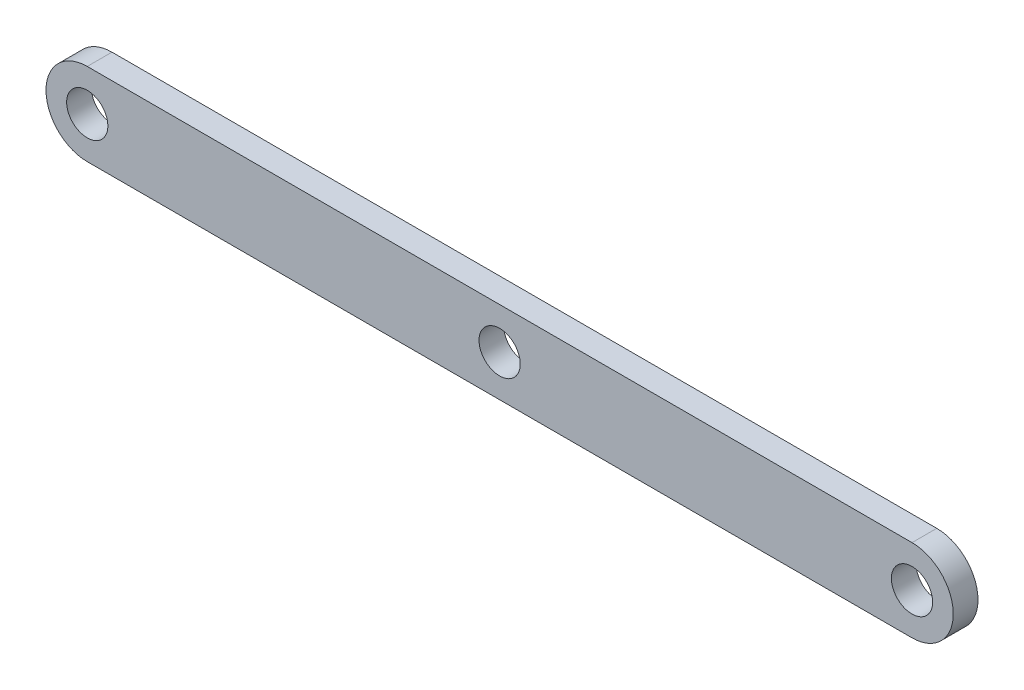
ISO-10303-21;
HEADER;
FILE_DESCRIPTION(('STEP AP214'),'2;1');
FILE_NAME('part.step','',(''),(''),'','','');
FILE_SCHEMA(('AUTOMOTIVE_DESIGN { 1 0 10303 214 1 1 1 1 }'));
ENDSEC;
DATA;
#1=APPLICATION_CONTEXT('core data for automotive mechanical design processes');
#2=APPLICATION_PROTOCOL_DEFINITION('international standard','automotive_design',2000,#1);
#3=PRODUCT_CONTEXT('',#1,'mechanical');
#4=PRODUCT('Part','Part','',(#3));
#5=PRODUCT_RELATED_PRODUCT_CATEGORY('part','',(#4));
#6=PRODUCT_DEFINITION_FORMATION('','',#4);
#7=PRODUCT_DEFINITION_CONTEXT('part definition',#1,'design');
#8=PRODUCT_DEFINITION('design','',#6,#7);
#9=PRODUCT_DEFINITION_SHAPE('','',#8);
#10=(LENGTH_UNIT() NAMED_UNIT(*) SI_UNIT(.MILLI.,.METRE.));
#11=(NAMED_UNIT(*) PLANE_ANGLE_UNIT() SI_UNIT($,.RADIAN.));
#12=(NAMED_UNIT(*) SI_UNIT($,.STERADIAN.) SOLID_ANGLE_UNIT());
#13=UNCERTAINTY_MEASURE_WITH_UNIT(LENGTH_MEASURE(1.E-05),#10,'distance_accuracy_value','');
#14=(GEOMETRIC_REPRESENTATION_CONTEXT(3) GLOBAL_UNCERTAINTY_ASSIGNED_CONTEXT((#13)) GLOBAL_UNIT_ASSIGNED_CONTEXT((#10,
#11,#12)) REPRESENTATION_CONTEXT('',''));
#15=CARTESIAN_POINT('',(0.,0.,0.));
#16=DIRECTION('',(0.,0.,1.));
#17=DIRECTION('',(1.,0.,0.));
#18=AXIS2_PLACEMENT_3D('',#15,#16,#17);
#19=CARTESIAN_POINT('',(0.,5.,3.));
#20=DIRECTION('',(0.,0.,-1.));
#21=DIRECTION('',(-1.,0.,0.));
#22=AXIS2_PLACEMENT_3D('',#19,#20,#21);
#23=CYLINDRICAL_SURFACE('',#22,5.);
#24=CARTESIAN_POINT('',(0.,5.,0.));
#25=DIRECTION('',(0.,0.,1.));
#26=DIRECTION('',(1.,0.,0.));
#27=AXIS2_PLACEMENT_3D('',#24,#25,#26);
#28=CIRCLE('',#27,5.);
#29=CARTESIAN_POINT('',(0.,10.,0.));
#30=VERTEX_POINT('',#29);
#31=CARTESIAN_POINT('',(0.,0.,0.));
#32=VERTEX_POINT('',#31);
#33=EDGE_CURVE('E97',#30,#32,#28,.T.);
#34=ORIENTED_EDGE('',*,*,#33,.T.);
#35=DIRECTION('',(0.,0.,-1.));
#36=VECTOR('',#35,1.);
#37=CARTESIAN_POINT('',(0.,0.,3.));
#38=LINE('',#37,#36);
#39=CARTESIAN_POINT('',(0.,0.,3.));
#40=VERTEX_POINT('',#39);
#41=EDGE_CURVE('E11',#40,#32,#38,.T.);
#42=ORIENTED_EDGE('',*,*,#41,.F.);
#43=CARTESIAN_POINT('',(0.,5.,3.));
#44=DIRECTION('',(0.,0.,1.));
#45=DIRECTION('',(1.,0.,0.));
#46=AXIS2_PLACEMENT_3D('',#43,#44,#45);
#47=CIRCLE('',#46,5.);
#48=CARTESIAN_POINT('',(0.,10.,3.));
#49=VERTEX_POINT('',#48);
#50=EDGE_CURVE('E85',#49,#40,#47,.T.);
#51=ORIENTED_EDGE('',*,*,#50,.F.);
#52=DIRECTION('',(0.,0.,-1.));
#53=VECTOR('',#52,1.);
#54=CARTESIAN_POINT('',(0.,10.,3.));
#55=LINE('',#54,#53);
#56=EDGE_CURVE('E93',#49,#30,#55,.T.);
#57=ORIENTED_EDGE('',*,*,#56,.T.);
#58=EDGE_LOOP('',(#34,#42,#51,#57));
#59=FACE_BOUND('',#58,.T.);
#60=ADVANCED_FACE('F34',(#59),#23,.T.);
#61=CARTESIAN_POINT('',(0.,0.,3.));
#62=DIRECTION('',(0.,1.,0.));
#63=DIRECTION('',(0.,0.,1.));
#64=AXIS2_PLACEMENT_3D('',#61,#62,#63);
#65=PLANE('',#64);
#66=DIRECTION('',(1.,0.,0.));
#67=VECTOR('',#66,1.);
#68=CARTESIAN_POINT('',(0.,0.,0.));
#69=LINE('',#68,#67);
#70=CARTESIAN_POINT('',(100.,0.,0.));
#71=VERTEX_POINT('',#70);
#72=EDGE_CURVE('E89',#32,#71,#69,.T.);
#73=ORIENTED_EDGE('',*,*,#72,.T.);
#74=DIRECTION('',(0.,0.,-1.));
#75=VECTOR('',#74,1.);
#76=CARTESIAN_POINT('',(100.,0.,3.));
#77=LINE('',#76,#75);
#78=CARTESIAN_POINT('',(100.,0.,3.));
#79=VERTEX_POINT('',#78);
#80=EDGE_CURVE('E42',#79,#71,#77,.T.);
#81=ORIENTED_EDGE('',*,*,#80,.F.);
#82=DIRECTION('',(1.,0.,0.));
#83=VECTOR('',#82,1.);
#84=CARTESIAN_POINT('',(0.,0.,3.));
#85=LINE('',#84,#83);
#86=EDGE_CURVE('E80',#40,#79,#85,.T.);
#87=ORIENTED_EDGE('',*,*,#86,.F.);
#88=ORIENTED_EDGE('',*,*,#41,.T.);
#89=EDGE_LOOP('',(#73,#81,#87,#88));
#90=FACE_BOUND('',#89,.T.);
#91=ADVANCED_FACE('F88',(#90),#65,.F.);
#92=CARTESIAN_POINT('',(100.,5.,3.));
#93=DIRECTION('',(0.,0.,-1.));
#94=DIRECTION('',(-1.,0.,0.));
#95=AXIS2_PLACEMENT_3D('',#92,#93,#94);
#96=CYLINDRICAL_SURFACE('',#95,5.);
#97=CARTESIAN_POINT('',(100.,5.,0.));
#98=DIRECTION('',(0.,0.,1.));
#99=DIRECTION('',(-1.,0.,0.));
#100=AXIS2_PLACEMENT_3D('',#97,#98,#99);
#101=CIRCLE('',#100,5.);
#102=CARTESIAN_POINT('',(100.,10.,0.));
#103=VERTEX_POINT('',#102);
#104=EDGE_CURVE('E67',#71,#103,#101,.T.);
#105=ORIENTED_EDGE('',*,*,#104,.T.);
#106=DIRECTION('',(0.,0.,-1.));
#107=VECTOR('',#106,1.);
#108=CARTESIAN_POINT('',(100.,10.,3.));
#109=LINE('',#108,#107);
#110=CARTESIAN_POINT('',(100.,10.,3.));
#111=VERTEX_POINT('',#110);
#112=EDGE_CURVE('E90',#111,#103,#109,.T.);
#113=ORIENTED_EDGE('',*,*,#112,.F.);
#114=CARTESIAN_POINT('',(100.,5.,3.));
#115=DIRECTION('',(0.,0.,1.));
#116=DIRECTION('',(-1.,0.,0.));
#117=AXIS2_PLACEMENT_3D('',#114,#115,#116);
#118=CIRCLE('',#117,5.);
#119=EDGE_CURVE('E83',#79,#111,#118,.T.);
#120=ORIENTED_EDGE('',*,*,#119,.F.);
#121=ORIENTED_EDGE('',*,*,#80,.T.);
#122=EDGE_LOOP('',(#105,#113,#120,#121));
#123=FACE_BOUND('',#122,.T.);
#124=ADVANCED_FACE('F91',(#123),#96,.T.);
#125=CARTESIAN_POINT('',(0.,10.,3.));
#126=DIRECTION('',(0.,-1.,0.));
#127=DIRECTION('',(0.,0.,-1.));
#128=AXIS2_PLACEMENT_3D('',#125,#126,#127);
#129=PLANE('',#128);
#130=DIRECTION('',(-1.,0.,0.));
#131=VECTOR('',#130,1.);
#132=CARTESIAN_POINT('',(0.,10.,0.));
#133=LINE('',#132,#131);
#134=EDGE_CURVE('E73',#103,#30,#133,.T.);
#135=ORIENTED_EDGE('',*,*,#134,.T.);
#136=ORIENTED_EDGE('',*,*,#56,.F.);
#137=DIRECTION('',(-1.,0.,0.));
#138=VECTOR('',#137,1.);
#139=CARTESIAN_POINT('',(0.,10.,3.));
#140=LINE('',#139,#138);
#141=EDGE_CURVE('E50',#111,#49,#140,.T.);
#142=ORIENTED_EDGE('',*,*,#141,.F.);
#143=ORIENTED_EDGE('',*,*,#112,.T.);
#144=EDGE_LOOP('',(#135,#136,#142,#143));
#145=FACE_BOUND('',#144,.T.);
#146=ADVANCED_FACE('F105',(#145),#129,.F.);
#147=CARTESIAN_POINT('',(0.,5.,3.));
#148=DIRECTION('',(0.,0.,1.));
#149=DIRECTION('',(1.,0.,0.));
#150=AXIS2_PLACEMENT_3D('',#147,#148,#149);
#151=PLANE('',#150);
#152=CARTESIAN_POINT('',(50.,5.,3.));
#153=DIRECTION('',(0.,0.,1.));
#154=DIRECTION('',(1.,0.,0.));
#155=AXIS2_PLACEMENT_3D('',#152,#153,#154);
#156=CIRCLE('',#155,2.5);
#157=CARTESIAN_POINT('',(52.5,5.,3.));
#158=VERTEX_POINT('',#157);
#159=EDGE_CURVE('E123',#158,#158,#156,.T.);
#160=ORIENTED_EDGE('',*,*,#159,.F.);
#161=EDGE_LOOP('',(#160));
#162=FACE_BOUND('',#161,.T.);
#163=CARTESIAN_POINT('',(100.,5.,3.));
#164=DIRECTION('',(0.,0.,1.));
#165=DIRECTION('',(1.,0.,0.));
#166=AXIS2_PLACEMENT_3D('',#163,#164,#165);
#167=CIRCLE('',#166,2.5);
#168=CARTESIAN_POINT('',(102.5,5.,3.));
#169=VERTEX_POINT('',#168);
#170=EDGE_CURVE('E117',#169,#169,#167,.T.);
#171=ORIENTED_EDGE('',*,*,#170,.F.);
#172=EDGE_LOOP('',(#171));
#173=FACE_BOUND('',#172,.T.);
#174=CARTESIAN_POINT('',(0.,5.,3.));
#175=DIRECTION('',(0.,0.,1.));
#176=DIRECTION('',(1.,0.,0.));
#177=AXIS2_PLACEMENT_3D('',#174,#175,#176);
#178=CIRCLE('',#177,2.5);
#179=CARTESIAN_POINT('',(2.5,5.,3.));
#180=VERTEX_POINT('',#179);
#181=EDGE_CURVE('E111',#180,#180,#178,.T.);
#182=ORIENTED_EDGE('',*,*,#181,.F.);
#183=EDGE_LOOP('',(#182));
#184=FACE_BOUND('',#183,.T.);
#185=ORIENTED_EDGE('',*,*,#50,.T.);
#186=ORIENTED_EDGE('',*,*,#86,.T.);
#187=ORIENTED_EDGE('',*,*,#119,.T.);
#188=ORIENTED_EDGE('',*,*,#141,.T.);
#189=EDGE_LOOP('',(#185,#186,#187,#188));
#190=FACE_BOUND('',#189,.T.);
#191=ADVANCED_FACE('F81',(#162,#173,#184,#190),#151,.T.);
#192=CARTESIAN_POINT('',(0.,5.,0.));
#193=DIRECTION('',(0.,0.,1.));
#194=DIRECTION('',(1.,0.,0.));
#195=AXIS2_PLACEMENT_3D('',#192,#193,#194);
#196=PLANE('',#195);
#197=CARTESIAN_POINT('',(50.,5.,0.));
#198=DIRECTION('',(0.,0.,1.));
#199=DIRECTION('',(1.,0.,0.));
#200=AXIS2_PLACEMENT_3D('',#197,#198,#199);
#201=CIRCLE('',#200,2.5);
#202=CARTESIAN_POINT('',(52.5,5.,0.));
#203=VERTEX_POINT('',#202);
#204=EDGE_CURVE('E120',#203,#203,#201,.T.);
#205=ORIENTED_EDGE('',*,*,#204,.T.);
#206=EDGE_LOOP('',(#205));
#207=FACE_BOUND('',#206,.T.);
#208=CARTESIAN_POINT('',(100.,5.,0.));
#209=DIRECTION('',(0.,0.,1.));
#210=DIRECTION('',(1.,0.,0.));
#211=AXIS2_PLACEMENT_3D('',#208,#209,#210);
#212=CIRCLE('',#211,2.5);
#213=CARTESIAN_POINT('',(102.5,5.,0.));
#214=VERTEX_POINT('',#213);
#215=EDGE_CURVE('E114',#214,#214,#212,.T.);
#216=ORIENTED_EDGE('',*,*,#215,.T.);
#217=EDGE_LOOP('',(#216));
#218=FACE_BOUND('',#217,.T.);
#219=CARTESIAN_POINT('',(0.,5.,0.));
#220=DIRECTION('',(0.,0.,1.));
#221=DIRECTION('',(1.,0.,0.));
#222=AXIS2_PLACEMENT_3D('',#219,#220,#221);
#223=CIRCLE('',#222,2.5);
#224=CARTESIAN_POINT('',(2.5,5.,0.));
#225=VERTEX_POINT('',#224);
#226=EDGE_CURVE('E100',#225,#225,#223,.T.);
#227=ORIENTED_EDGE('',*,*,#226,.T.);
#228=EDGE_LOOP('',(#227));
#229=FACE_BOUND('',#228,.T.);
#230=ORIENTED_EDGE('',*,*,#33,.F.);
#231=ORIENTED_EDGE('',*,*,#134,.F.);
#232=ORIENTED_EDGE('',*,*,#104,.F.);
#233=ORIENTED_EDGE('',*,*,#72,.F.);
#234=EDGE_LOOP('',(#230,#231,#232,#233));
#235=FACE_BOUND('',#234,.T.);
#236=ADVANCED_FACE('F108',(#207,#218,#229,#235),#196,.F.);
#237=CARTESIAN_POINT('',(0.,5.,0.));
#238=DIRECTION('',(0.,0.,1.));
#239=DIRECTION('',(1.,0.,0.));
#240=AXIS2_PLACEMENT_3D('',#237,#238,#239);
#241=CYLINDRICAL_SURFACE('',#240,2.5);
#242=ORIENTED_EDGE('',*,*,#226,.F.);
#243=EDGE_LOOP('',(#242));
#244=FACE_BOUND('',#243,.T.);
#245=ORIENTED_EDGE('',*,*,#181,.T.);
#246=EDGE_LOOP('',(#245));
#247=FACE_BOUND('',#246,.T.);
#248=ADVANCED_FACE('F145',(#244,#247),#241,.F.);
#249=CARTESIAN_POINT('',(100.,5.,0.));
#250=DIRECTION('',(0.,0.,1.));
#251=DIRECTION('',(1.,0.,0.));
#252=AXIS2_PLACEMENT_3D('',#249,#250,#251);
#253=CYLINDRICAL_SURFACE('',#252,2.5);
#254=ORIENTED_EDGE('',*,*,#215,.F.);
#255=EDGE_LOOP('',(#254));
#256=FACE_BOUND('',#255,.T.);
#257=ORIENTED_EDGE('',*,*,#170,.T.);
#258=EDGE_LOOP('',(#257));
#259=FACE_BOUND('',#258,.T.);
#260=ADVANCED_FACE('F134',(#256,#259),#253,.F.);
#261=CARTESIAN_POINT('',(50.,5.,0.));
#262=DIRECTION('',(0.,0.,1.));
#263=DIRECTION('',(1.,0.,0.));
#264=AXIS2_PLACEMENT_3D('',#261,#262,#263);
#265=CYLINDRICAL_SURFACE('',#264,2.5);
#266=ORIENTED_EDGE('',*,*,#204,.F.);
#267=EDGE_LOOP('',(#266));
#268=FACE_BOUND('',#267,.T.);
#269=ORIENTED_EDGE('',*,*,#159,.T.);
#270=EDGE_LOOP('',(#269));
#271=FACE_BOUND('',#270,.T.);
#272=ADVANCED_FACE('F131',(#268,#271),#265,.F.);
#273=CLOSED_SHELL('',(#60,#91,#124,#146,#191,#236,#248,#260,#272));
#274=MANIFOLD_SOLID_BREP('B2',#273);
#275=ADVANCED_BREP_SHAPE_REPRESENTATION('',(#18,#274),#14);
#276=SHAPE_DEFINITION_REPRESENTATION(#9,#275);
ENDSEC;
END-ISO-10303-21;
